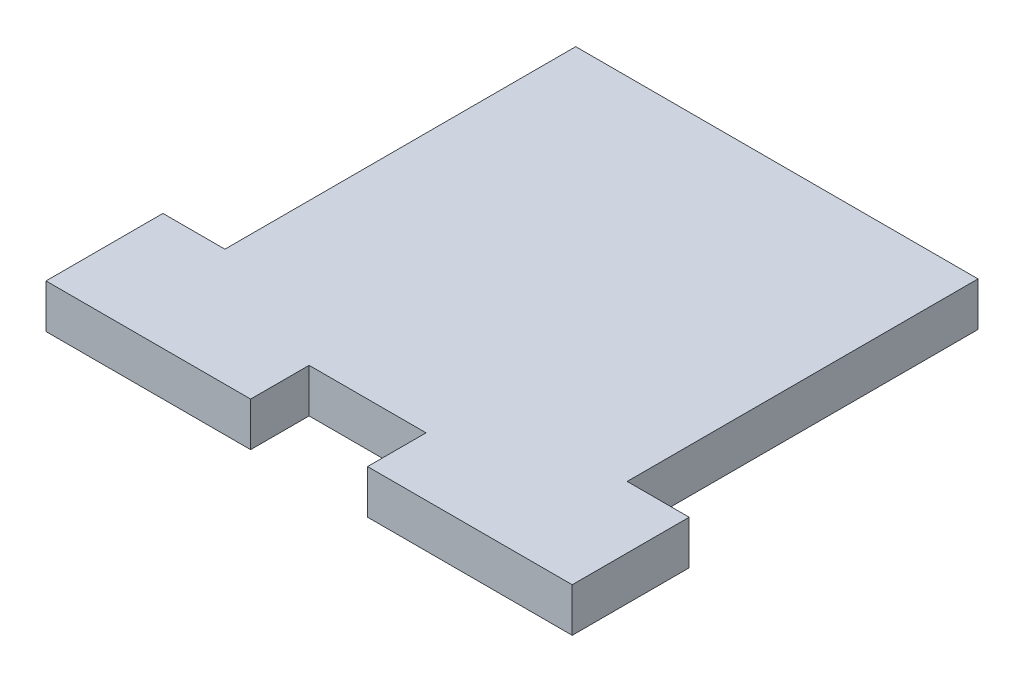
ISO-10303-21;
HEADER;
FILE_DESCRIPTION(('STEP AP214'),'2;1');
FILE_NAME('part.step','',(''),(''),'','','');
FILE_SCHEMA(('AUTOMOTIVE_DESIGN { 1 0 10303 214 1 1 1 1 }'));
ENDSEC;
DATA;
#1=APPLICATION_CONTEXT('core data for automotive mechanical design processes');
#2=APPLICATION_PROTOCOL_DEFINITION('international standard','automotive_design',2000,#1);
#3=PRODUCT_CONTEXT('',#1,'mechanical');
#4=PRODUCT('Part','Part','',(#3));
#5=PRODUCT_RELATED_PRODUCT_CATEGORY('part','',(#4));
#6=PRODUCT_DEFINITION_FORMATION('','',#4);
#7=PRODUCT_DEFINITION_CONTEXT('part definition',#1,'design');
#8=PRODUCT_DEFINITION('design','',#6,#7);
#9=PRODUCT_DEFINITION_SHAPE('','',#8);
#10=(LENGTH_UNIT() NAMED_UNIT(*) SI_UNIT(.MILLI.,.METRE.));
#11=(NAMED_UNIT(*) PLANE_ANGLE_UNIT() SI_UNIT($,.RADIAN.));
#12=(NAMED_UNIT(*) SI_UNIT($,.STERADIAN.) SOLID_ANGLE_UNIT());
#13=UNCERTAINTY_MEASURE_WITH_UNIT(LENGTH_MEASURE(1.E-05),#10,'distance_accuracy_value','');
#14=(GEOMETRIC_REPRESENTATION_CONTEXT(3) GLOBAL_UNCERTAINTY_ASSIGNED_CONTEXT((#13)) GLOBAL_UNIT_ASSIGNED_CONTEXT((#10,
#11,#12)) REPRESENTATION_CONTEXT('',''));
#15=CARTESIAN_POINT('',(0.,0.,0.));
#16=DIRECTION('',(0.,0.,1.));
#17=DIRECTION('',(1.,0.,0.));
#18=AXIS2_PLACEMENT_3D('',#15,#16,#17);
#19=CARTESIAN_POINT('',(0.,-7.5,60.));
#20=DIRECTION('',(1.,0.,0.));
#21=DIRECTION('',(0.,0.,-1.));
#22=AXIS2_PLACEMENT_3D('',#19,#20,#21);
#23=PLANE('',#22);
#24=DIRECTION('',(0.,0.,-1.));
#25=VECTOR('',#24,1.);
#26=CARTESIAN_POINT('',(0.,0.,60.));
#27=LINE('',#26,#25);
#28=CARTESIAN_POINT('',(0.,0.,60.));
#29=VERTEX_POINT('',#28);
#30=CARTESIAN_POINT('',(0.,0.,0.));
#31=VERTEX_POINT('',#30);
#32=EDGE_CURVE('E154',#29,#31,#27,.T.);
#33=ORIENTED_EDGE('',*,*,#32,.F.);
#34=DIRECTION('',(0.,1.,0.));
#35=VECTOR('',#34,1.);
#36=CARTESIAN_POINT('',(0.,-7.5,60.));
#37=LINE('',#36,#35);
#38=CARTESIAN_POINT('',(0.,-7.5,60.));
#39=VERTEX_POINT('',#38);
#40=EDGE_CURVE('E11',#39,#29,#37,.T.);
#41=ORIENTED_EDGE('',*,*,#40,.F.);
#42=DIRECTION('',(0.,0.,-1.));
#43=VECTOR('',#42,1.);
#44=CARTESIAN_POINT('',(0.,-7.5,60.));
#45=LINE('',#44,#43);
#46=CARTESIAN_POINT('',(0.,-7.5,0.));
#47=VERTEX_POINT('',#46);
#48=EDGE_CURVE('E186',#39,#47,#45,.T.);
#49=ORIENTED_EDGE('',*,*,#48,.T.);
#50=DIRECTION('',(0.,1.,0.));
#51=VECTOR('',#50,1.);
#52=CARTESIAN_POINT('',(0.,-7.5,0.));
#53=LINE('',#52,#51);
#54=EDGE_CURVE('E36',#47,#31,#53,.T.);
#55=ORIENTED_EDGE('',*,*,#54,.T.);
#56=EDGE_LOOP('',(#33,#41,#49,#55));
#57=FACE_BOUND('',#56,.T.);
#58=ADVANCED_FACE('F33',(#57),#23,.T.);
#59=CARTESIAN_POINT('',(10.6,-7.5,60.));
#60=DIRECTION('',(0.,0.,-1.));
#61=DIRECTION('',(-1.,0.,0.));
#62=AXIS2_PLACEMENT_3D('',#59,#60,#61);
#63=PLANE('',#62);
#64=DIRECTION('',(-1.,0.,0.));
#65=VECTOR('',#64,1.);
#66=CARTESIAN_POINT('',(10.6,0.,60.));
#67=LINE('',#66,#65);
#68=CARTESIAN_POINT('',(10.6,0.,60.));
#69=VERTEX_POINT('',#68);
#70=EDGE_CURVE('E184',#69,#29,#67,.T.);
#71=ORIENTED_EDGE('',*,*,#70,.F.);
#72=DIRECTION('',(0.,1.,0.));
#73=VECTOR('',#72,1.);
#74=CARTESIAN_POINT('',(10.6,-7.5,60.));
#75=LINE('',#74,#73);
#76=CARTESIAN_POINT('',(10.6,-7.5,60.));
#77=VERTEX_POINT('',#76);
#78=EDGE_CURVE('E42',#77,#69,#75,.T.);
#79=ORIENTED_EDGE('',*,*,#78,.F.);
#80=DIRECTION('',(-1.,0.,0.));
#81=VECTOR('',#80,1.);
#82=CARTESIAN_POINT('',(10.6,-7.5,60.));
#83=LINE('',#82,#81);
#84=EDGE_CURVE('E144',#77,#39,#83,.T.);
#85=ORIENTED_EDGE('',*,*,#84,.T.);
#86=ORIENTED_EDGE('',*,*,#40,.T.);
#87=EDGE_LOOP('',(#71,#79,#85,#86));
#88=FACE_BOUND('',#87,.T.);
#89=ADVANCED_FACE('F206',(#88),#63,.T.);
#90=CARTESIAN_POINT('',(10.6,-7.5,80.));
#91=DIRECTION('',(1.,0.,0.));
#92=DIRECTION('',(0.,0.,-1.));
#93=AXIS2_PLACEMENT_3D('',#90,#91,#92);
#94=PLANE('',#93);
#95=DIRECTION('',(0.,0.,-1.));
#96=VECTOR('',#95,1.);
#97=CARTESIAN_POINT('',(10.6,0.,80.));
#98=LINE('',#97,#96);
#99=CARTESIAN_POINT('',(10.6,0.,80.));
#100=VERTEX_POINT('',#99);
#101=EDGE_CURVE('E131',#100,#69,#98,.T.);
#102=ORIENTED_EDGE('',*,*,#101,.F.);
#103=DIRECTION('',(0.,1.,0.));
#104=VECTOR('',#103,1.);
#105=CARTESIAN_POINT('',(10.6,-7.5,80.));
#106=LINE('',#105,#104);
#107=CARTESIAN_POINT('',(10.6,-7.5,80.));
#108=VERTEX_POINT('',#107);
#109=EDGE_CURVE('E126',#108,#100,#106,.T.);
#110=ORIENTED_EDGE('',*,*,#109,.F.);
#111=DIRECTION('',(0.,0.,-1.));
#112=VECTOR('',#111,1.);
#113=CARTESIAN_POINT('',(10.6,-7.5,80.));
#114=LINE('',#113,#112);
#115=EDGE_CURVE('E129',#108,#77,#114,.T.);
#116=ORIENTED_EDGE('',*,*,#115,.T.);
#117=ORIENTED_EDGE('',*,*,#78,.T.);
#118=EDGE_LOOP('',(#102,#110,#116,#117));
#119=FACE_BOUND('',#118,.T.);
#120=ADVANCED_FACE('F128',(#119),#94,.T.);
#121=CARTESIAN_POINT('',(-24.4,-7.5,80.));
#122=DIRECTION('',(0.,0.,1.));
#123=DIRECTION('',(1.,0.,0.));
#124=AXIS2_PLACEMENT_3D('',#121,#122,#123);
#125=PLANE('',#124);
#126=DIRECTION('',(1.,0.,0.));
#127=VECTOR('',#126,1.);
#128=CARTESIAN_POINT('',(-24.4,0.,80.));
#129=LINE('',#128,#127);
#130=CARTESIAN_POINT('',(-24.4,0.,80.));
#131=VERTEX_POINT('',#130);
#132=EDGE_CURVE('E181',#131,#100,#129,.T.);
#133=ORIENTED_EDGE('',*,*,#132,.F.);
#134=DIRECTION('',(0.,1.,0.));
#135=VECTOR('',#134,1.);
#136=CARTESIAN_POINT('',(-24.4,-7.5,80.));
#137=LINE('',#136,#135);
#138=CARTESIAN_POINT('',(-24.4,-7.5,80.));
#139=VERTEX_POINT('',#138);
#140=EDGE_CURVE('E136',#139,#131,#137,.T.);
#141=ORIENTED_EDGE('',*,*,#140,.F.);
#142=DIRECTION('',(1.,0.,0.));
#143=VECTOR('',#142,1.);
#144=CARTESIAN_POINT('',(-24.4,-7.5,80.));
#145=LINE('',#144,#143);
#146=EDGE_CURVE('E142',#139,#108,#145,.T.);
#147=ORIENTED_EDGE('',*,*,#146,.T.);
#148=ORIENTED_EDGE('',*,*,#109,.T.);
#149=EDGE_LOOP('',(#133,#141,#147,#148));
#150=FACE_BOUND('',#149,.T.);
#151=ADVANCED_FACE('F146',(#150),#125,.T.);
#152=CARTESIAN_POINT('',(-24.4,-7.5,70.));
#153=DIRECTION('',(-1.,0.,0.));
#154=DIRECTION('',(0.,0.,1.));
#155=AXIS2_PLACEMENT_3D('',#152,#153,#154);
#156=PLANE('',#155);
#157=DIRECTION('',(0.,0.,1.));
#158=VECTOR('',#157,1.);
#159=CARTESIAN_POINT('',(-24.4,0.,70.));
#160=LINE('',#159,#158);
#161=CARTESIAN_POINT('',(-24.4,0.,70.));
#162=VERTEX_POINT('',#161);
#163=EDGE_CURVE('E178',#162,#131,#160,.T.);
#164=ORIENTED_EDGE('',*,*,#163,.F.);
#165=DIRECTION('',(0.,1.,0.));
#166=VECTOR('',#165,1.);
#167=CARTESIAN_POINT('',(-24.4,-7.5,70.));
#168=LINE('',#167,#166);
#169=CARTESIAN_POINT('',(-24.4,-7.5,70.));
#170=VERTEX_POINT('',#169);
#171=EDGE_CURVE('E190',#170,#162,#168,.T.);
#172=ORIENTED_EDGE('',*,*,#171,.F.);
#173=DIRECTION('',(0.,0.,1.));
#174=VECTOR('',#173,1.);
#175=CARTESIAN_POINT('',(-24.4,-7.5,70.));
#176=LINE('',#175,#174);
#177=EDGE_CURVE('E147',#170,#139,#176,.T.);
#178=ORIENTED_EDGE('',*,*,#177,.T.);
#179=ORIENTED_EDGE('',*,*,#140,.T.);
#180=EDGE_LOOP('',(#164,#172,#178,#179));
#181=FACE_BOUND('',#180,.T.);
#182=ADVANCED_FACE('F219',(#181),#156,.T.);
#183=CARTESIAN_POINT('',(-44.4,-7.5,70.));
#184=DIRECTION('',(0.,0.,1.));
#185=DIRECTION('',(1.,0.,0.));
#186=AXIS2_PLACEMENT_3D('',#183,#184,#185);
#187=PLANE('',#186);
#188=DIRECTION('',(1.,0.,0.));
#189=VECTOR('',#188,1.);
#190=CARTESIAN_POINT('',(-44.4,0.,70.));
#191=LINE('',#190,#189);
#192=CARTESIAN_POINT('',(-44.4,0.,70.));
#193=VERTEX_POINT('',#192);
#194=EDGE_CURVE('E175',#193,#162,#191,.T.);
#195=ORIENTED_EDGE('',*,*,#194,.F.);
#196=DIRECTION('',(0.,1.,0.));
#197=VECTOR('',#196,1.);
#198=CARTESIAN_POINT('',(-44.4,-7.5,70.));
#199=LINE('',#198,#197);
#200=CARTESIAN_POINT('',(-44.4,-7.5,70.));
#201=VERTEX_POINT('',#200);
#202=EDGE_CURVE('E192',#201,#193,#199,.T.);
#203=ORIENTED_EDGE('',*,*,#202,.F.);
#204=DIRECTION('',(1.,0.,0.));
#205=VECTOR('',#204,1.);
#206=CARTESIAN_POINT('',(-44.4,-7.5,70.));
#207=LINE('',#206,#205);
#208=EDGE_CURVE('E149',#201,#170,#207,.T.);
#209=ORIENTED_EDGE('',*,*,#208,.T.);
#210=ORIENTED_EDGE('',*,*,#171,.T.);
#211=EDGE_LOOP('',(#195,#203,#209,#210));
#212=FACE_BOUND('',#211,.T.);
#213=ADVANCED_FACE('F222',(#212),#187,.T.);
#214=CARTESIAN_POINT('',(-44.4,-7.5,80.));
#215=DIRECTION('',(1.,0.,0.));
#216=DIRECTION('',(0.,0.,-1.));
#217=AXIS2_PLACEMENT_3D('',#214,#215,#216);
#218=PLANE('',#217);
#219=DIRECTION('',(0.,0.,-1.));
#220=VECTOR('',#219,1.);
#221=CARTESIAN_POINT('',(-44.4,0.,80.));
#222=LINE('',#221,#220);
#223=CARTESIAN_POINT('',(-44.4,0.,80.));
#224=VERTEX_POINT('',#223);
#225=EDGE_CURVE('E172',#224,#193,#222,.T.);
#226=ORIENTED_EDGE('',*,*,#225,.F.);
#227=DIRECTION('',(0.,1.,0.));
#228=VECTOR('',#227,1.);
#229=CARTESIAN_POINT('',(-44.4,-7.5,80.));
#230=LINE('',#229,#228);
#231=CARTESIAN_POINT('',(-44.4,-7.5,80.));
#232=VERTEX_POINT('',#231);
#233=EDGE_CURVE('E194',#232,#224,#230,.T.);
#234=ORIENTED_EDGE('',*,*,#233,.F.);
#235=DIRECTION('',(0.,0.,-1.));
#236=VECTOR('',#235,1.);
#237=CARTESIAN_POINT('',(-44.4,-7.5,80.));
#238=LINE('',#237,#236);
#239=EDGE_CURVE('E348',#232,#201,#238,.T.);
#240=ORIENTED_EDGE('',*,*,#239,.T.);
#241=ORIENTED_EDGE('',*,*,#202,.T.);
#242=EDGE_LOOP('',(#226,#234,#240,#241));
#243=FACE_BOUND('',#242,.T.);
#244=ADVANCED_FACE('F226',(#243),#218,.T.);
#245=CARTESIAN_POINT('',(-79.4,-7.5,80.));
#246=DIRECTION('',(0.,0.,1.));
#247=DIRECTION('',(1.,0.,0.));
#248=AXIS2_PLACEMENT_3D('',#245,#246,#247);
#249=PLANE('',#248);
#250=DIRECTION('',(1.,0.,0.));
#251=VECTOR('',#250,1.);
#252=CARTESIAN_POINT('',(-79.4,0.,80.));
#253=LINE('',#252,#251);
#254=CARTESIAN_POINT('',(-79.4,0.,80.));
#255=VERTEX_POINT('',#254);
#256=EDGE_CURVE('E169',#255,#224,#253,.T.);
#257=ORIENTED_EDGE('',*,*,#256,.F.);
#258=DIRECTION('',(0.,1.,0.));
#259=VECTOR('',#258,1.);
#260=CARTESIAN_POINT('',(-79.4,-7.5,80.));
#261=LINE('',#260,#259);
#262=CARTESIAN_POINT('',(-79.4,-7.5,80.));
#263=VERTEX_POINT('',#262);
#264=EDGE_CURVE('E196',#263,#255,#261,.T.);
#265=ORIENTED_EDGE('',*,*,#264,.F.);
#266=DIRECTION('',(1.,0.,0.));
#267=VECTOR('',#266,1.);
#268=CARTESIAN_POINT('',(-79.4,-7.5,80.));
#269=LINE('',#268,#267);
#270=EDGE_CURVE('E352',#263,#232,#269,.T.);
#271=ORIENTED_EDGE('',*,*,#270,.T.);
#272=ORIENTED_EDGE('',*,*,#233,.T.);
#273=EDGE_LOOP('',(#257,#265,#271,#272));
#274=FACE_BOUND('',#273,.T.);
#275=ADVANCED_FACE('F230',(#274),#249,.T.);
#276=CARTESIAN_POINT('',(-79.4,-7.5,60.));
#277=DIRECTION('',(-1.,0.,0.));
#278=DIRECTION('',(0.,0.,1.));
#279=AXIS2_PLACEMENT_3D('',#276,#277,#278);
#280=PLANE('',#279);
#281=DIRECTION('',(0.,0.,1.));
#282=VECTOR('',#281,1.);
#283=CARTESIAN_POINT('',(-79.4,0.,60.));
#284=LINE('',#283,#282);
#285=CARTESIAN_POINT('',(-79.4,0.,60.));
#286=VERTEX_POINT('',#285);
#287=EDGE_CURVE('E166',#286,#255,#284,.T.);
#288=ORIENTED_EDGE('',*,*,#287,.F.);
#289=DIRECTION('',(0.,1.,0.));
#290=VECTOR('',#289,1.);
#291=CARTESIAN_POINT('',(-79.4,-7.5,60.));
#292=LINE('',#291,#290);
#293=CARTESIAN_POINT('',(-79.4,-7.5,60.));
#294=VERTEX_POINT('',#293);
#295=EDGE_CURVE('E198',#294,#286,#292,.T.);
#296=ORIENTED_EDGE('',*,*,#295,.F.);
#297=DIRECTION('',(0.,0.,1.));
#298=VECTOR('',#297,1.);
#299=CARTESIAN_POINT('',(-79.4,-7.5,60.));
#300=LINE('',#299,#298);
#301=EDGE_CURVE('E341',#294,#263,#300,.T.);
#302=ORIENTED_EDGE('',*,*,#301,.T.);
#303=ORIENTED_EDGE('',*,*,#264,.T.);
#304=EDGE_LOOP('',(#288,#296,#302,#303));
#305=FACE_BOUND('',#304,.T.);
#306=ADVANCED_FACE('F234',(#305),#280,.T.);
#307=CARTESIAN_POINT('',(-68.8,-7.5,60.));
#308=DIRECTION('',(0.,0.,-1.));
#309=DIRECTION('',(-1.,0.,0.));
#310=AXIS2_PLACEMENT_3D('',#307,#308,#309);
#311=PLANE('',#310);
#312=DIRECTION('',(-1.,0.,0.));
#313=VECTOR('',#312,1.);
#314=CARTESIAN_POINT('',(-68.8,0.,60.));
#315=LINE('',#314,#313);
#316=CARTESIAN_POINT('',(-68.8,0.,60.));
#317=VERTEX_POINT('',#316);
#318=EDGE_CURVE('E163',#317,#286,#315,.T.);
#319=ORIENTED_EDGE('',*,*,#318,.F.);
#320=DIRECTION('',(0.,1.,0.));
#321=VECTOR('',#320,1.);
#322=CARTESIAN_POINT('',(-68.8,-7.5,60.));
#323=LINE('',#322,#321);
#324=CARTESIAN_POINT('',(-68.8,-7.5,60.));
#325=VERTEX_POINT('',#324);
#326=EDGE_CURVE('E200',#325,#317,#323,.T.);
#327=ORIENTED_EDGE('',*,*,#326,.F.);
#328=DIRECTION('',(-1.,0.,0.));
#329=VECTOR('',#328,1.);
#330=CARTESIAN_POINT('',(-68.8,-7.5,60.));
#331=LINE('',#330,#329);
#332=EDGE_CURVE('E337',#325,#294,#331,.T.);
#333=ORIENTED_EDGE('',*,*,#332,.T.);
#334=ORIENTED_EDGE('',*,*,#295,.T.);
#335=EDGE_LOOP('',(#319,#327,#333,#334));
#336=FACE_BOUND('',#335,.T.);
#337=ADVANCED_FACE('F238',(#336),#311,.T.);
#338=CARTESIAN_POINT('',(-68.8,-7.5,0.));
#339=DIRECTION('',(-1.,0.,0.));
#340=DIRECTION('',(0.,0.,1.));
#341=AXIS2_PLACEMENT_3D('',#338,#339,#340);
#342=PLANE('',#341);
#343=DIRECTION('',(0.,0.,1.));
#344=VECTOR('',#343,1.);
#345=CARTESIAN_POINT('',(-68.8,0.,0.));
#346=LINE('',#345,#344);
#347=CARTESIAN_POINT('',(-68.8,0.,0.));
#348=VERTEX_POINT('',#347);
#349=EDGE_CURVE('E160',#348,#317,#346,.T.);
#350=ORIENTED_EDGE('',*,*,#349,.F.);
#351=DIRECTION('',(0.,1.,0.));
#352=VECTOR('',#351,1.);
#353=CARTESIAN_POINT('',(-68.8,-7.5,0.));
#354=LINE('',#353,#352);
#355=CARTESIAN_POINT('',(-68.8,-7.5,0.));
#356=VERTEX_POINT('',#355);
#357=EDGE_CURVE('E201',#356,#348,#354,.T.);
#358=ORIENTED_EDGE('',*,*,#357,.F.);
#359=DIRECTION('',(0.,0.,1.));
#360=VECTOR('',#359,1.);
#361=CARTESIAN_POINT('',(-68.8,-7.5,0.));
#362=LINE('',#361,#360);
#363=EDGE_CURVE('E358',#356,#325,#362,.T.);
#364=ORIENTED_EDGE('',*,*,#363,.T.);
#365=ORIENTED_EDGE('',*,*,#326,.T.);
#366=EDGE_LOOP('',(#350,#358,#364,#365));
#367=FACE_BOUND('',#366,.T.);
#368=ADVANCED_FACE('F242',(#367),#342,.T.);
#369=CARTESIAN_POINT('',(0.,-7.5,0.));
#370=DIRECTION('',(0.,0.,-1.));
#371=DIRECTION('',(-1.,0.,0.));
#372=AXIS2_PLACEMENT_3D('',#369,#370,#371);
#373=PLANE('',#372);
#374=DIRECTION('',(-1.,0.,0.));
#375=VECTOR('',#374,1.);
#376=CARTESIAN_POINT('',(0.,0.,0.));
#377=LINE('',#376,#375);
#378=EDGE_CURVE('E157',#31,#348,#377,.T.);
#379=ORIENTED_EDGE('',*,*,#378,.F.);
#380=ORIENTED_EDGE('',*,*,#54,.F.);
#381=DIRECTION('',(-1.,0.,0.));
#382=VECTOR('',#381,1.);
#383=CARTESIAN_POINT('',(0.,-7.5,0.));
#384=LINE('',#383,#382);
#385=EDGE_CURVE('E360',#47,#356,#384,.T.);
#386=ORIENTED_EDGE('',*,*,#385,.T.);
#387=ORIENTED_EDGE('',*,*,#357,.T.);
#388=EDGE_LOOP('',(#379,#380,#386,#387));
#389=FACE_BOUND('',#388,.T.);
#390=ADVANCED_FACE('F203',(#389),#373,.T.);
#391=CARTESIAN_POINT('',(0.,-7.5,0.));
#392=DIRECTION('',(0.,1.,0.));
#393=DIRECTION('',(0.,0.,1.));
#394=AXIS2_PLACEMENT_3D('',#391,#392,#393);
#395=PLANE('',#394);
#396=ORIENTED_EDGE('',*,*,#48,.F.);
#397=ORIENTED_EDGE('',*,*,#84,.F.);
#398=ORIENTED_EDGE('',*,*,#115,.F.);
#399=ORIENTED_EDGE('',*,*,#146,.F.);
#400=ORIENTED_EDGE('',*,*,#177,.F.);
#401=ORIENTED_EDGE('',*,*,#208,.F.);
#402=ORIENTED_EDGE('',*,*,#239,.F.);
#403=ORIENTED_EDGE('',*,*,#270,.F.);
#404=ORIENTED_EDGE('',*,*,#301,.F.);
#405=ORIENTED_EDGE('',*,*,#332,.F.);
#406=ORIENTED_EDGE('',*,*,#363,.F.);
#407=ORIENTED_EDGE('',*,*,#385,.F.);
#408=EDGE_LOOP('',(#396,#397,#398,#399,#400,#401,#402,#403,#404,#405,#406,#407));
#409=FACE_BOUND('',#408,.T.);
#410=ADVANCED_FACE('F140',(#409),#395,.F.);
#411=CARTESIAN_POINT('',(0.,0.,0.));
#412=DIRECTION('',(0.,1.,0.));
#413=DIRECTION('',(0.,0.,1.));
#414=AXIS2_PLACEMENT_3D('',#411,#412,#413);
#415=PLANE('',#414);
#416=ORIENTED_EDGE('',*,*,#32,.T.);
#417=ORIENTED_EDGE('',*,*,#378,.T.);
#418=ORIENTED_EDGE('',*,*,#349,.T.);
#419=ORIENTED_EDGE('',*,*,#318,.T.);
#420=ORIENTED_EDGE('',*,*,#287,.T.);
#421=ORIENTED_EDGE('',*,*,#256,.T.);
#422=ORIENTED_EDGE('',*,*,#225,.T.);
#423=ORIENTED_EDGE('',*,*,#194,.T.);
#424=ORIENTED_EDGE('',*,*,#163,.T.);
#425=ORIENTED_EDGE('',*,*,#132,.T.);
#426=ORIENTED_EDGE('',*,*,#101,.T.);
#427=ORIENTED_EDGE('',*,*,#70,.T.);
#428=EDGE_LOOP('',(#416,#417,#418,#419,#420,#421,#422,#423,#424,#425,#426,#427));
#429=FACE_BOUND('',#428,.T.);
#430=ADVANCED_FACE('F205',(#429),#415,.T.);
#431=CLOSED_SHELL('',(#58,#89,#120,#151,#182,#213,#244,#275,#306,#337,#368,#390,#410,#430));
#432=MANIFOLD_SOLID_BREP('B2',#431);
#433=ADVANCED_BREP_SHAPE_REPRESENTATION('',(#18,#432),#14);
#434=SHAPE_DEFINITION_REPRESENTATION(#9,#433);
ENDSEC;
END-ISO-10303-21;
